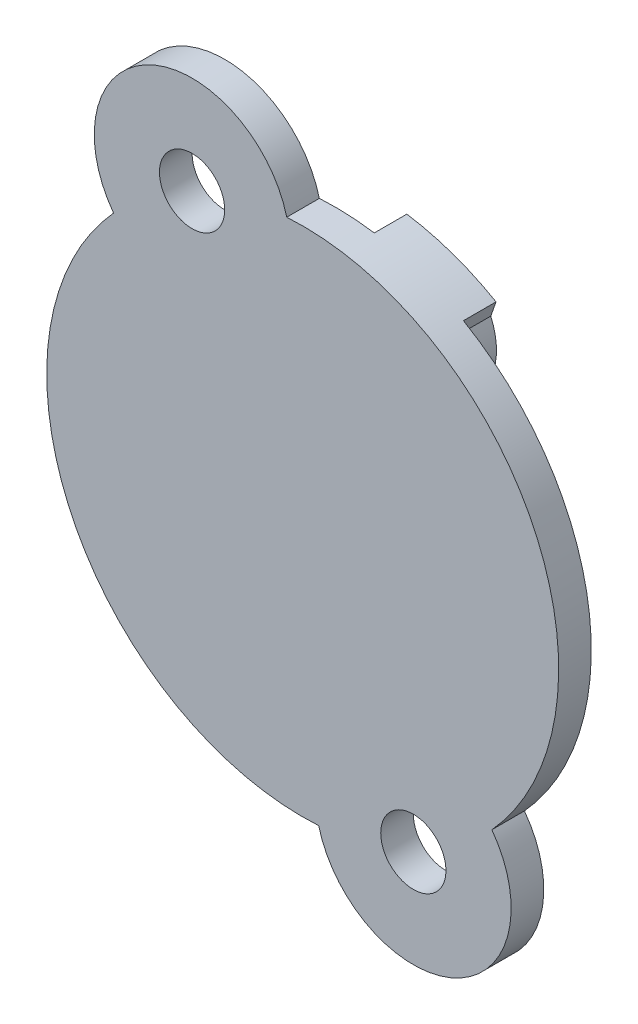
ISO-10303-21;
HEADER;
FILE_DESCRIPTION(('STEP AP214'),'2;1');
FILE_NAME('part.step','',(''),(''),'','','');
FILE_SCHEMA(('AUTOMOTIVE_DESIGN { 1 0 10303 214 1 1 1 1 }'));
ENDSEC;
DATA;
#1=APPLICATION_CONTEXT('core data for automotive mechanical design processes');
#2=APPLICATION_PROTOCOL_DEFINITION('international standard','automotive_design',2000,#1);
#3=PRODUCT_CONTEXT('',#1,'mechanical');
#4=PRODUCT('Part','Part','',(#3));
#5=PRODUCT_RELATED_PRODUCT_CATEGORY('part','',(#4));
#6=PRODUCT_DEFINITION_FORMATION('','',#4);
#7=PRODUCT_DEFINITION_CONTEXT('part definition',#1,'design');
#8=PRODUCT_DEFINITION('design','',#6,#7);
#9=PRODUCT_DEFINITION_SHAPE('','',#8);
#10=(LENGTH_UNIT() NAMED_UNIT(*) SI_UNIT(.MILLI.,.METRE.));
#11=(NAMED_UNIT(*) PLANE_ANGLE_UNIT() SI_UNIT($,.RADIAN.));
#12=(NAMED_UNIT(*) SI_UNIT($,.STERADIAN.) SOLID_ANGLE_UNIT());
#13=UNCERTAINTY_MEASURE_WITH_UNIT(LENGTH_MEASURE(1.E-05),#10,'distance_accuracy_value','');
#14=(GEOMETRIC_REPRESENTATION_CONTEXT(3) GLOBAL_UNCERTAINTY_ASSIGNED_CONTEXT((#13)) GLOBAL_UNIT_ASSIGNED_CONTEXT((#10,
#11,#12)) REPRESENTATION_CONTEXT('',''));
#15=CARTESIAN_POINT('',(0.,0.,0.));
#16=DIRECTION('',(0.,0.,1.));
#17=DIRECTION('',(1.,0.,0.));
#18=AXIS2_PLACEMENT_3D('',#15,#16,#17);
#19=CARTESIAN_POINT('',(0.,0.,1.));
#20=DIRECTION('',(0.,0.,-1.));
#21=DIRECTION('',(-1.,0.,0.));
#22=AXIS2_PLACEMENT_3D('',#19,#20,#21);
#23=CYLINDRICAL_SURFACE('',#22,7.85);
#24=CARTESIAN_POINT('',(0.,0.,0.));
#25=DIRECTION('',(0.,0.,1.));
#26=DIRECTION('',(1.,0.,0.));
#27=AXIS2_PLACEMENT_3D('',#24,#25,#26);
#28=CIRCLE('',#27,7.85);
#29=CARTESIAN_POINT('',(1.19385224811337,7.7586865389494,0.));
#30=VERTEX_POINT('',#29);
#31=CARTESIAN_POINT('',(-0.48961697061972,7.83471602689473,0.));
#32=VERTEX_POINT('',#31);
#33=EDGE_CURVE('E166',#30,#32,#28,.T.);
#34=ORIENTED_EDGE('',*,*,#33,.T.);
#35=DIRECTION('',(0.,0.,-1.));
#36=VECTOR('',#35,1.);
#37=CARTESIAN_POINT('',(-0.489616970619721,7.83471602689473,1.));
#38=LINE('',#37,#36);
#39=CARTESIAN_POINT('',(-0.48961697061972,7.83471602689473,1.));
#40=VERTEX_POINT('',#39);
#41=EDGE_CURVE('E67',#40,#32,#38,.T.);
#42=ORIENTED_EDGE('',*,*,#41,.F.);
#43=CARTESIAN_POINT('',(0.,0.,1.));
#44=DIRECTION('',(0.,0.,1.));
#45=DIRECTION('',(1.,0.,0.));
#46=AXIS2_PLACEMENT_3D('',#43,#44,#45);
#47=CIRCLE('',#46,7.85);
#48=CARTESIAN_POINT('',(5.80055716096692,-5.28923781109863,1.));
#49=VERTEX_POINT('',#48);
#50=EDGE_CURVE('E11',#49,#40,#47,.T.);
#51=ORIENTED_EDGE('',*,*,#50,.F.);
#52=DIRECTION('',(0.,0.,-1.));
#53=VECTOR('',#52,1.);
#54=CARTESIAN_POINT('',(5.80055716096691,-5.28923781109863,1.));
#55=LINE('',#54,#53);
#56=CARTESIAN_POINT('',(5.80055716096691,-5.28923781109863,0.));
#57=VERTEX_POINT('',#56);
#58=EDGE_CURVE('E192',#49,#57,#55,.T.);
#59=ORIENTED_EDGE('',*,*,#58,.T.);
#60=CARTESIAN_POINT('',(3.92933098166978,6.79579708617687,0.));
#61=VERTEX_POINT('',#60);
#62=EDGE_CURVE('E167',#57,#61,#28,.T.);
#63=ORIENTED_EDGE('',*,*,#62,.T.);
#64=DIRECTION('',(0.,0.,1.));
#65=VECTOR('',#64,1.);
#66=CARTESIAN_POINT('',(3.92933098166978,6.79579708617687,-1.));
#67=LINE('',#66,#65);
#68=CARTESIAN_POINT('',(3.92933098166978,6.79579708617687,-1.));
#69=VERTEX_POINT('',#68);
#70=EDGE_CURVE('E281',#69,#61,#67,.T.);
#71=ORIENTED_EDGE('',*,*,#70,.F.);
#72=CARTESIAN_POINT('',(0.,0.,-1.));
#73=DIRECTION('',(0.,0.,-1.));
#74=DIRECTION('',(-1.,0.,0.));
#75=AXIS2_PLACEMENT_3D('',#72,#73,#74);
#76=CIRCLE('',#75,7.85);
#77=CARTESIAN_POINT('',(1.19385224811337,7.7586865389494,-1.));
#78=VERTEX_POINT('',#77);
#79=EDGE_CURVE('E214',#78,#69,#76,.T.);
#80=ORIENTED_EDGE('',*,*,#79,.F.);
#81=DIRECTION('',(0.,0.,1.));
#82=VECTOR('',#81,1.);
#83=CARTESIAN_POINT('',(1.19385224811337,7.7586865389494,-1.));
#84=LINE('',#83,#82);
#85=EDGE_CURVE('E284',#78,#30,#84,.T.);
#86=ORIENTED_EDGE('',*,*,#85,.T.);
#87=EDGE_LOOP('',(#34,#42,#51,#59,#63,#71,#80,#86));
#88=FACE_BOUND('',#87,.T.);
#89=ADVANCED_FACE('F44',(#88),#23,.T.);
#90=CARTESIAN_POINT('',(0.,0.,0.));
#91=DIRECTION('',(0.,0.,1.));
#92=DIRECTION('',(1.,0.,0.));
#93=AXIS2_PLACEMENT_3D('',#90,#91,#92);
#94=PLANE('',#93);
#95=CARTESIAN_POINT('',(3.39285093810405,-7.07891676118645,0.));
#96=DIRECTION('',(0.,0.,-1.));
#97=DIRECTION('',(-1.,0.,0.));
#98=AXIS2_PLACEMENT_3D('',#95,#96,#97);
#99=CIRCLE('',#98,1.);
#100=CARTESIAN_POINT('',(2.39285093810405,-7.07891676118645,0.));
#101=VERTEX_POINT('',#100);
#102=EDGE_CURVE('E189',#101,#101,#99,.T.);
#103=ORIENTED_EDGE('',*,*,#102,.F.);
#104=EDGE_LOOP('',(#103));
#105=FACE_BOUND('',#104,.T.);
#106=CARTESIAN_POINT('',(-1.1938522481134,-7.7586865389494,0.));
#107=VERTEX_POINT('',#106);
#108=CARTESIAN_POINT('',(0.48961697061972,-7.83471602689473,0.));
#109=VERTEX_POINT('',#108);
#110=EDGE_CURVE('E48',#107,#109,#28,.T.);
#111=ORIENTED_EDGE('',*,*,#110,.F.);
#112=DIRECTION('',(0.332030845783635,0.943268528812556,0.));
#113=VECTOR('',#112,1.);
#114=CARTESIAN_POINT('',(1.3677393667782,-0.481444726386268,0.));
#115=LINE('',#114,#113);
#116=CARTESIAN_POINT('',(-1.03201281787639,-7.29891587847587,0.));
#117=VERTEX_POINT('',#116);
#118=EDGE_CURVE('E254',#107,#117,#115,.T.);
#119=ORIENTED_EDGE('',*,*,#118,.T.);
#120=CARTESIAN_POINT('',(-1.94238044783427,-5.51812089355345,0.));
#121=DIRECTION('',(0.,0.,-1.));
#122=DIRECTION('',(-1.,0.,0.));
#123=AXIS2_PLACEMENT_3D('',#120,#121,#122);
#124=CIRCLE('',#123,2.);
#125=CARTESIAN_POINT('',(-0.00130016548269144,-5.99999985913081,0.));
#126=VERTEX_POINT('',#125);
#127=EDGE_CURVE('E251',#126,#117,#124,.T.);
#128=ORIENTED_EDGE('',*,*,#127,.F.);
#129=CARTESIAN_POINT('',(0.,0.,0.));
#130=DIRECTION('',(0.,0.,-1.));
#131=DIRECTION('',(-1.,0.,0.));
#132=AXIS2_PLACEMENT_3D('',#129,#130,#131);
#133=CIRCLE('',#132,6.);
#134=CARTESIAN_POINT('',(3.75731738749284,4.6778805082691,0.));
#135=VERTEX_POINT('',#134);
#136=EDGE_CURVE('E239',#135,#126,#133,.T.);
#137=ORIENTED_EDGE('',*,*,#136,.F.);
#138=CARTESIAN_POINT('',(1.94238044783427,5.51812089355344,0.));
#139=DIRECTION('',(0.,0.,-1.));
#140=DIRECTION('',(-1.,0.,0.));
#141=AXIS2_PLACEMENT_3D('',#138,#139,#140);
#142=CIRCLE('',#141,2.);
#143=CARTESIAN_POINT('',(3.76749155143278,6.33602642570336,0.));
#144=VERTEX_POINT('',#143);
#145=EDGE_CURVE('E248',#144,#135,#142,.T.);
#146=ORIENTED_EDGE('',*,*,#145,.F.);
#147=DIRECTION('',(0.332030845783633,0.943268528812557,0.));
#148=VECTOR('',#147,1.);
#149=CARTESIAN_POINT('',(1.36773936677821,-0.481444726386269,0.));
#150=LINE('',#149,#148);
#151=EDGE_CURVE('E245',#144,#61,#150,.T.);
#152=ORIENTED_EDGE('',*,*,#151,.T.);
#153=ORIENTED_EDGE('',*,*,#62,.F.);
#154=CARTESIAN_POINT('',(3.39285093810405,-7.07891676118645,0.));
#155=DIRECTION('',(0.,0.,-1.));
#156=DIRECTION('',(-1.,0.,0.));
#157=AXIS2_PLACEMENT_3D('',#154,#155,#156);
#158=CIRCLE('',#157,3.);
#159=EDGE_CURVE('E183',#57,#109,#158,.T.);
#160=ORIENTED_EDGE('',*,*,#159,.T.);
#161=EDGE_LOOP('',(#111,#119,#128,#137,#146,#152,#153,#160));
#162=FACE_BOUND('',#161,.T.);
#163=ADVANCED_FACE('F305',(#105,#162),#94,.F.);
#164=CARTESIAN_POINT('',(-5.80055716096691,5.28923781109863,1.));
#165=VERTEX_POINT('',#164);
#166=CARTESIAN_POINT('',(0.48961697061972,-7.83471602689473,1.));
#167=VERTEX_POINT('',#166);
#168=EDGE_CURVE('E53',#165,#167,#47,.T.);
#169=ORIENTED_EDGE('',*,*,#168,.F.);
#170=DIRECTION('',(0.,0.,-1.));
#171=VECTOR('',#170,1.);
#172=CARTESIAN_POINT('',(-5.80055716096693,5.28923781109865,1.));
#173=LINE('',#172,#171);
#174=CARTESIAN_POINT('',(-5.80055716096693,5.28923781109865,0.));
#175=VERTEX_POINT('',#174);
#176=EDGE_CURVE('E168',#165,#175,#173,.T.);
#177=ORIENTED_EDGE('',*,*,#176,.T.);
#178=CARTESIAN_POINT('',(-3.92933098166981,-6.79579708617685,0.));
#179=VERTEX_POINT('',#178);
#180=EDGE_CURVE('E158',#175,#179,#28,.T.);
#181=ORIENTED_EDGE('',*,*,#180,.T.);
#182=DIRECTION('',(0.,0.,1.));
#183=VECTOR('',#182,1.);
#184=CARTESIAN_POINT('',(-3.92933098166981,-6.79579708617685,-1.));
#185=LINE('',#184,#183);
#186=CARTESIAN_POINT('',(-3.92933098166981,-6.79579708617685,-1.));
#187=VERTEX_POINT('',#186);
#188=EDGE_CURVE('E264',#187,#179,#185,.T.);
#189=ORIENTED_EDGE('',*,*,#188,.F.);
#190=CARTESIAN_POINT('',(0.,0.,-1.));
#191=DIRECTION('',(0.,0.,-1.));
#192=DIRECTION('',(-1.,0.,0.));
#193=AXIS2_PLACEMENT_3D('',#190,#191,#192);
#194=CIRCLE('',#193,7.85);
#195=CARTESIAN_POINT('',(-1.1938522481134,-7.7586865389494,-1.));
#196=VERTEX_POINT('',#195);
#197=EDGE_CURVE('E226',#196,#187,#194,.T.);
#198=ORIENTED_EDGE('',*,*,#197,.F.);
#199=DIRECTION('',(0.,0.,1.));
#200=VECTOR('',#199,1.);
#201=CARTESIAN_POINT('',(-1.1938522481134,-7.7586865389494,-1.));
#202=LINE('',#201,#200);
#203=EDGE_CURVE('E266',#196,#107,#202,.T.);
#204=ORIENTED_EDGE('',*,*,#203,.T.);
#205=ORIENTED_EDGE('',*,*,#110,.T.);
#206=DIRECTION('',(0.,0.,-1.));
#207=VECTOR('',#206,1.);
#208=CARTESIAN_POINT('',(0.48961697061972,-7.83471602689473,1.));
#209=LINE('',#208,#207);
#210=EDGE_CURVE('E197',#167,#109,#209,.T.);
#211=ORIENTED_EDGE('',*,*,#210,.F.);
#212=EDGE_LOOP('',(#169,#177,#181,#189,#198,#204,#205,#211));
#213=FACE_BOUND('',#212,.T.);
#214=ADVANCED_FACE('F46',(#213),#23,.T.);
#215=CARTESIAN_POINT('',(0.,0.,1.));
#216=DIRECTION('',(0.,0.,1.));
#217=DIRECTION('',(1.,0.,0.));
#218=AXIS2_PLACEMENT_3D('',#215,#216,#217);
#219=PLANE('',#218);
#220=CARTESIAN_POINT('',(3.39285093810405,-7.07891676118645,1.));
#221=DIRECTION('',(0.,0.,-1.));
#222=DIRECTION('',(-1.,0.,0.));
#223=AXIS2_PLACEMENT_3D('',#220,#221,#222);
#224=CIRCLE('',#223,1.);
#225=CARTESIAN_POINT('',(2.39285093810405,-7.07891676118645,1.));
#226=VERTEX_POINT('',#225);
#227=EDGE_CURVE('E188',#226,#226,#224,.T.);
#228=ORIENTED_EDGE('',*,*,#227,.T.);
#229=EDGE_LOOP('',(#228));
#230=FACE_BOUND('',#229,.T.);
#231=CARTESIAN_POINT('',(-3.39285093810405,7.07891676118645,1.));
#232=DIRECTION('',(0.,0.,-1.));
#233=DIRECTION('',(-1.,0.,0.));
#234=AXIS2_PLACEMENT_3D('',#231,#232,#233);
#235=CIRCLE('',#234,0.999999999999999);
#236=CARTESIAN_POINT('',(-4.39285093810405,7.07891676118645,1.));
#237=VERTEX_POINT('',#236);
#238=EDGE_CURVE('E172',#237,#237,#235,.T.);
#239=ORIENTED_EDGE('',*,*,#238,.T.);
#240=EDGE_LOOP('',(#239));
#241=FACE_BOUND('',#240,.T.);
#242=ORIENTED_EDGE('',*,*,#50,.T.);
#243=CARTESIAN_POINT('',(-3.39285093810405,7.07891676118645,1.));
#244=DIRECTION('',(0.,0.,-1.));
#245=DIRECTION('',(-1.,0.,0.));
#246=AXIS2_PLACEMENT_3D('',#243,#244,#245);
#247=CIRCLE('',#246,3.);
#248=EDGE_CURVE('E178',#165,#40,#247,.T.);
#249=ORIENTED_EDGE('',*,*,#248,.F.);
#250=ORIENTED_EDGE('',*,*,#168,.T.);
#251=CARTESIAN_POINT('',(3.39285093810405,-7.07891676118645,1.));
#252=DIRECTION('',(0.,0.,-1.));
#253=DIRECTION('',(-1.,0.,0.));
#254=AXIS2_PLACEMENT_3D('',#251,#252,#253);
#255=CIRCLE('',#254,3.);
#256=EDGE_CURVE('E185',#49,#167,#255,.T.);
#257=ORIENTED_EDGE('',*,*,#256,.F.);
#258=EDGE_LOOP('',(#242,#249,#250,#257));
#259=FACE_BOUND('',#258,.T.);
#260=ADVANCED_FACE('F298',(#230,#241,#259),#219,.T.);
#261=CARTESIAN_POINT('',(-3.39285093810405,7.07891676118645,0.));
#262=DIRECTION('',(0.,0.,-1.));
#263=DIRECTION('',(-1.,0.,0.));
#264=AXIS2_PLACEMENT_3D('',#261,#262,#263);
#265=CIRCLE('',#264,0.999999999999999);
#266=CARTESIAN_POINT('',(-4.39285093810405,7.07891676118645,0.));
#267=VERTEX_POINT('',#266);
#268=EDGE_CURVE('E175',#267,#267,#265,.T.);
#269=ORIENTED_EDGE('',*,*,#268,.F.);
#270=EDGE_LOOP('',(#269));
#271=FACE_BOUND('',#270,.T.);
#272=DIRECTION('',(0.332030845783634,0.943268528812557,0.));
#273=VECTOR('',#272,1.);
#274=CARTESIAN_POINT('',(-1.36773936677823,0.481444726386276,0.));
#275=LINE('',#274,#273);
#276=CARTESIAN_POINT('',(-3.7674915514328,-6.33602642570332,0.));
#277=VERTEX_POINT('',#276);
#278=EDGE_CURVE('E163',#179,#277,#275,.T.);
#279=ORIENTED_EDGE('',*,*,#278,.F.);
#280=ORIENTED_EDGE('',*,*,#180,.F.);
#281=CARTESIAN_POINT('',(-3.39285093810405,7.07891676118645,0.));
#282=DIRECTION('',(0.,0.,-1.));
#283=DIRECTION('',(-1.,0.,0.));
#284=AXIS2_PLACEMENT_3D('',#281,#282,#283);
#285=CIRCLE('',#284,3.);
#286=EDGE_CURVE('E161',#175,#32,#285,.T.);
#287=ORIENTED_EDGE('',*,*,#286,.T.);
#288=ORIENTED_EDGE('',*,*,#33,.F.);
#289=DIRECTION('',(0.332030845783635,0.943268528812556,0.));
#290=VECTOR('',#289,1.);
#291=CARTESIAN_POINT('',(-1.36773936677822,0.481444726386275,0.));
#292=LINE('',#291,#290);
#293=CARTESIAN_POINT('',(1.03201281787635,7.29891587847585,0.));
#294=VERTEX_POINT('',#293);
#295=EDGE_CURVE('E242',#294,#30,#292,.T.);
#296=ORIENTED_EDGE('',*,*,#295,.F.);
#297=CARTESIAN_POINT('',(1.94238044783427,5.51812089355344,0.));
#298=DIRECTION('',(0.,0.,-1.));
#299=DIRECTION('',(-1.,0.,0.));
#300=AXIS2_PLACEMENT_3D('',#297,#298,#299);
#301=CIRCLE('',#300,2.);
#302=CARTESIAN_POINT('',(0.00130016548269252,5.99999985913081,0.));
#303=VERTEX_POINT('',#302);
#304=EDGE_CURVE('E238',#303,#294,#301,.T.);
#305=ORIENTED_EDGE('',*,*,#304,.F.);
#306=CARTESIAN_POINT('',(-3.75731738749284,-4.6778805082691,0.));
#307=VERTEX_POINT('',#306);
#308=EDGE_CURVE('E235',#307,#303,#133,.T.);
#309=ORIENTED_EDGE('',*,*,#308,.F.);
#310=CARTESIAN_POINT('',(-1.94238044783427,-5.51812089355345,0.));
#311=DIRECTION('',(0.,0.,-1.));
#312=DIRECTION('',(-1.,0.,0.));
#313=AXIS2_PLACEMENT_3D('',#310,#311,#312);
#314=CIRCLE('',#313,2.);
#315=EDGE_CURVE('E206',#277,#307,#314,.T.);
#316=ORIENTED_EDGE('',*,*,#315,.F.);
#317=EDGE_LOOP('',(#279,#280,#287,#288,#296,#305,#309,#316));
#318=FACE_BOUND('',#317,.T.);
#319=ADVANCED_FACE('F159',(#271,#318),#94,.F.);
#320=CARTESIAN_POINT('',(0.,0.,-1.));
#321=DIRECTION('',(0.,0.,1.));
#322=DIRECTION('',(1.,0.,0.));
#323=AXIS2_PLACEMENT_3D('',#320,#321,#322);
#324=CYLINDRICAL_SURFACE('',#323,6.);
#325=ORIENTED_EDGE('',*,*,#308,.T.);
#326=DIRECTION('',(0.,0.,1.));
#327=VECTOR('',#326,1.);
#328=CARTESIAN_POINT('',(0.00130016548269252,5.99999985913081,-1.));
#329=LINE('',#328,#327);
#330=CARTESIAN_POINT('',(0.00130016548269252,5.99999985913081,-1.));
#331=VERTEX_POINT('',#330);
#332=EDGE_CURVE('E290',#331,#303,#329,.T.);
#333=ORIENTED_EDGE('',*,*,#332,.F.);
#334=CARTESIAN_POINT('',(0.,0.,-1.));
#335=DIRECTION('',(0.,0.,-1.));
#336=DIRECTION('',(-1.,0.,0.));
#337=AXIS2_PLACEMENT_3D('',#334,#335,#336);
#338=CIRCLE('',#337,6.);
#339=CARTESIAN_POINT('',(-3.75731738749284,-4.6778805082691,-1.));
#340=VERTEX_POINT('',#339);
#341=EDGE_CURVE('E205',#340,#331,#338,.T.);
#342=ORIENTED_EDGE('',*,*,#341,.F.);
#343=DIRECTION('',(0.,0.,1.));
#344=VECTOR('',#343,1.);
#345=CARTESIAN_POINT('',(-3.75731738749284,-4.6778805082691,-1.));
#346=LINE('',#345,#344);
#347=EDGE_CURVE('E232',#340,#307,#346,.T.);
#348=ORIENTED_EDGE('',*,*,#347,.T.);
#349=EDGE_LOOP('',(#325,#333,#342,#348));
#350=FACE_BOUND('',#349,.T.);
#351=ADVANCED_FACE('F336',(#350),#324,.T.);
#352=CARTESIAN_POINT('',(1.94238044783427,5.51812089355344,-1.));
#353=DIRECTION('',(0.,0.,1.));
#354=DIRECTION('',(1.,0.,0.));
#355=AXIS2_PLACEMENT_3D('',#352,#353,#354);
#356=CYLINDRICAL_SURFACE('',#355,2.);
#357=ORIENTED_EDGE('',*,*,#304,.T.);
#358=DIRECTION('',(0.,0.,1.));
#359=VECTOR('',#358,1.);
#360=CARTESIAN_POINT('',(1.03201281787635,7.29891587847585,-1.));
#361=LINE('',#360,#359);
#362=CARTESIAN_POINT('',(1.03201281787635,7.29891587847585,-1.));
#363=VERTEX_POINT('',#362);
#364=EDGE_CURVE('E287',#363,#294,#361,.T.);
#365=ORIENTED_EDGE('',*,*,#364,.F.);
#366=CARTESIAN_POINT('',(1.94238044783427,5.51812089355344,-1.));
#367=DIRECTION('',(0.,0.,-1.));
#368=DIRECTION('',(-1.,0.,0.));
#369=AXIS2_PLACEMENT_3D('',#366,#367,#368);
#370=CIRCLE('',#369,2.);
#371=EDGE_CURVE('E209',#331,#363,#370,.T.);
#372=ORIENTED_EDGE('',*,*,#371,.F.);
#373=ORIENTED_EDGE('',*,*,#332,.T.);
#374=EDGE_LOOP('',(#357,#365,#372,#373));
#375=FACE_BOUND('',#374,.T.);
#376=ADVANCED_FACE('F345',(#375),#356,.T.);
#377=CARTESIAN_POINT('',(-1.36773936677822,0.481444726386275,-1.));
#378=DIRECTION('',(0.943268528812556,-0.332030845783635,0.));
#379=DIRECTION('',(0.332030845783635,0.943268528812556,0.));
#380=AXIS2_PLACEMENT_3D('',#377,#378,#379);
#381=PLANE('',#380);
#382=ORIENTED_EDGE('',*,*,#295,.T.);
#383=ORIENTED_EDGE('',*,*,#85,.F.);
#384=DIRECTION('',(0.332030845783635,0.943268528812556,0.));
#385=VECTOR('',#384,1.);
#386=CARTESIAN_POINT('',(-1.36773936677822,0.481444726386275,-1.));
#387=LINE('',#386,#385);
#388=EDGE_CURVE('E212',#363,#78,#387,.T.);
#389=ORIENTED_EDGE('',*,*,#388,.F.);
#390=ORIENTED_EDGE('',*,*,#364,.T.);
#391=EDGE_LOOP('',(#382,#383,#389,#390));
#392=FACE_BOUND('',#391,.T.);
#393=ADVANCED_FACE('F348',(#392),#381,.F.);
#394=CARTESIAN_POINT('',(1.36773936677821,-0.481444726386269,-1.));
#395=DIRECTION('',(0.943268528812557,-0.332030845783633,0.));
#396=DIRECTION('',(0.332030845783633,0.943268528812557,0.));
#397=AXIS2_PLACEMENT_3D('',#394,#395,#396);
#398=PLANE('',#397);
#399=ORIENTED_EDGE('',*,*,#151,.F.);
#400=DIRECTION('',(0.,0.,1.));
#401=VECTOR('',#400,1.);
#402=CARTESIAN_POINT('',(3.76749155143278,6.33602642570336,-1.));
#403=LINE('',#402,#401);
#404=CARTESIAN_POINT('',(3.76749155143278,6.33602642570336,-1.));
#405=VERTEX_POINT('',#404);
#406=EDGE_CURVE('E278',#405,#144,#403,.T.);
#407=ORIENTED_EDGE('',*,*,#406,.F.);
#408=DIRECTION('',(0.332030845783633,0.943268528812557,0.));
#409=VECTOR('',#408,1.);
#410=CARTESIAN_POINT('',(1.36773936677821,-0.481444726386269,-1.));
#411=LINE('',#410,#409);
#412=EDGE_CURVE('E216',#405,#69,#411,.T.);
#413=ORIENTED_EDGE('',*,*,#412,.T.);
#414=ORIENTED_EDGE('',*,*,#70,.T.);
#415=EDGE_LOOP('',(#399,#407,#413,#414));
#416=FACE_BOUND('',#415,.T.);
#417=ADVANCED_FACE('F351',(#416),#398,.T.);
#418=CARTESIAN_POINT('',(1.94238044783427,5.51812089355344,-1.));
#419=DIRECTION('',(0.,0.,1.));
#420=DIRECTION('',(1.,0.,0.));
#421=AXIS2_PLACEMENT_3D('',#418,#419,#420);
#422=CYLINDRICAL_SURFACE('',#421,2.);
#423=ORIENTED_EDGE('',*,*,#145,.T.);
#424=DIRECTION('',(0.,0.,1.));
#425=VECTOR('',#424,1.);
#426=CARTESIAN_POINT('',(3.75731738749284,4.6778805082691,-1.));
#427=LINE('',#426,#425);
#428=CARTESIAN_POINT('',(3.75731738749284,4.6778805082691,-1.));
#429=VERTEX_POINT('',#428);
#430=EDGE_CURVE('E275',#429,#135,#427,.T.);
#431=ORIENTED_EDGE('',*,*,#430,.F.);
#432=CARTESIAN_POINT('',(1.94238044783427,5.51812089355344,-1.));
#433=DIRECTION('',(0.,0.,-1.));
#434=DIRECTION('',(-1.,0.,0.));
#435=AXIS2_PLACEMENT_3D('',#432,#433,#434);
#436=CIRCLE('',#435,2.);
#437=EDGE_CURVE('E219',#405,#429,#436,.T.);
#438=ORIENTED_EDGE('',*,*,#437,.F.);
#439=ORIENTED_EDGE('',*,*,#406,.T.);
#440=EDGE_LOOP('',(#423,#431,#438,#439));
#441=FACE_BOUND('',#440,.T.);
#442=ADVANCED_FACE('F355',(#441),#422,.T.);
#443=ORIENTED_EDGE('',*,*,#136,.T.);
#444=DIRECTION('',(0.,0.,1.));
#445=VECTOR('',#444,1.);
#446=CARTESIAN_POINT('',(-0.00130016548269144,-5.99999985913081,-1.));
#447=LINE('',#446,#445);
#448=CARTESIAN_POINT('',(-0.00130016548269144,-5.99999985913081,-1.));
#449=VERTEX_POINT('',#448);
#450=EDGE_CURVE('E272',#449,#126,#447,.T.);
#451=ORIENTED_EDGE('',*,*,#450,.F.);
#452=EDGE_CURVE('E210',#429,#449,#338,.T.);
#453=ORIENTED_EDGE('',*,*,#452,.F.);
#454=ORIENTED_EDGE('',*,*,#430,.T.);
#455=EDGE_LOOP('',(#443,#451,#453,#454));
#456=FACE_BOUND('',#455,.T.);
#457=ADVANCED_FACE('F359',(#456),#324,.T.);
#458=CARTESIAN_POINT('',(-1.94238044783427,-5.51812089355345,-1.));
#459=DIRECTION('',(0.,0.,1.));
#460=DIRECTION('',(1.,0.,0.));
#461=AXIS2_PLACEMENT_3D('',#458,#459,#460);
#462=CYLINDRICAL_SURFACE('',#461,2.);
#463=ORIENTED_EDGE('',*,*,#127,.T.);
#464=DIRECTION('',(0.,0.,1.));
#465=VECTOR('',#464,1.);
#466=CARTESIAN_POINT('',(-1.03201281787639,-7.29891587847587,-1.));
#467=LINE('',#466,#465);
#468=CARTESIAN_POINT('',(-1.03201281787639,-7.29891587847587,-1.));
#469=VERTEX_POINT('',#468);
#470=EDGE_CURVE('E269',#469,#117,#467,.T.);
#471=ORIENTED_EDGE('',*,*,#470,.F.);
#472=CARTESIAN_POINT('',(-1.94238044783427,-5.51812089355345,-1.));
#473=DIRECTION('',(0.,0.,-1.));
#474=DIRECTION('',(-1.,0.,0.));
#475=AXIS2_PLACEMENT_3D('',#472,#473,#474);
#476=CIRCLE('',#475,2.);
#477=EDGE_CURVE('E221',#449,#469,#476,.T.);
#478=ORIENTED_EDGE('',*,*,#477,.F.);
#479=ORIENTED_EDGE('',*,*,#450,.T.);
#480=EDGE_LOOP('',(#463,#471,#478,#479));
#481=FACE_BOUND('',#480,.T.);
#482=ADVANCED_FACE('F363',(#481),#462,.T.);
#483=CARTESIAN_POINT('',(1.3677393667782,-0.481444726386268,-1.));
#484=DIRECTION('',(0.943268528812556,-0.332030845783635,0.));
#485=DIRECTION('',(0.332030845783635,0.943268528812556,0.));
#486=AXIS2_PLACEMENT_3D('',#483,#484,#485);
#487=PLANE('',#486);
#488=ORIENTED_EDGE('',*,*,#118,.F.);
#489=ORIENTED_EDGE('',*,*,#203,.F.);
#490=DIRECTION('',(0.332030845783635,0.943268528812556,0.));
#491=VECTOR('',#490,1.);
#492=CARTESIAN_POINT('',(1.3677393667782,-0.481444726386268,-1.));
#493=LINE('',#492,#491);
#494=EDGE_CURVE('E223',#196,#469,#493,.T.);
#495=ORIENTED_EDGE('',*,*,#494,.T.);
#496=ORIENTED_EDGE('',*,*,#470,.T.);
#497=EDGE_LOOP('',(#488,#489,#495,#496));
#498=FACE_BOUND('',#497,.T.);
#499=ADVANCED_FACE('F367',(#498),#487,.T.);
#500=CARTESIAN_POINT('',(-1.36773936677823,0.481444726386276,-1.));
#501=DIRECTION('',(0.943268528812557,-0.332030845783634,0.));
#502=DIRECTION('',(0.332030845783634,0.943268528812557,0.));
#503=AXIS2_PLACEMENT_3D('',#500,#501,#502);
#504=PLANE('',#503);
#505=ORIENTED_EDGE('',*,*,#278,.T.);
#506=DIRECTION('',(0.,0.,1.));
#507=VECTOR('',#506,1.);
#508=CARTESIAN_POINT('',(-3.7674915514328,-6.33602642570332,-1.));
#509=LINE('',#508,#507);
#510=CARTESIAN_POINT('',(-3.7674915514328,-6.33602642570332,-1.));
#511=VERTEX_POINT('',#510);
#512=EDGE_CURVE('E261',#511,#277,#509,.T.);
#513=ORIENTED_EDGE('',*,*,#512,.F.);
#514=DIRECTION('',(0.332030845783634,0.943268528812557,0.));
#515=VECTOR('',#514,1.);
#516=CARTESIAN_POINT('',(-1.36773936677823,0.481444726386276,-1.));
#517=LINE('',#516,#515);
#518=EDGE_CURVE('E228',#187,#511,#517,.T.);
#519=ORIENTED_EDGE('',*,*,#518,.F.);
#520=ORIENTED_EDGE('',*,*,#188,.T.);
#521=EDGE_LOOP('',(#505,#513,#519,#520));
#522=FACE_BOUND('',#521,.T.);
#523=ADVANCED_FACE('F343',(#522),#504,.F.);
#524=CARTESIAN_POINT('',(0.,0.,-1.));
#525=DIRECTION('',(0.,0.,1.));
#526=DIRECTION('',(1.,0.,0.));
#527=AXIS2_PLACEMENT_3D('',#524,#525,#526);
#528=CYLINDRICAL_SURFACE('',#527,4.5);
#529=CARTESIAN_POINT('',(0.,0.,-1.));
#530=DIRECTION('',(0.,0.,-1.));
#531=DIRECTION('',(-1.,0.,0.));
#532=AXIS2_PLACEMENT_3D('',#529,#530,#531);
#533=CIRCLE('',#532,4.5);
#534=CARTESIAN_POINT('',(-4.5,0.,-1.));
#535=VERTEX_POINT('',#534);
#536=EDGE_CURVE('E202',#535,#535,#533,.T.);
#537=ORIENTED_EDGE('',*,*,#536,.T.);
#538=EDGE_LOOP('',(#537));
#539=FACE_BOUND('',#538,.T.);
#540=CARTESIAN_POINT('',(0.,0.,0.));
#541=DIRECTION('',(0.,0.,-1.));
#542=DIRECTION('',(-1.,0.,0.));
#543=AXIS2_PLACEMENT_3D('',#540,#541,#542);
#544=CIRCLE('',#543,4.5);
#545=CARTESIAN_POINT('',(-4.5,0.,0.));
#546=VERTEX_POINT('',#545);
#547=EDGE_CURVE('E199',#546,#546,#544,.T.);
#548=ORIENTED_EDGE('',*,*,#547,.F.);
#549=EDGE_LOOP('',(#548));
#550=FACE_BOUND('',#549,.T.);
#551=ADVANCED_FACE('F339',(#539,#550),#528,.F.);
#552=CARTESIAN_POINT('',(-1.94238044783427,-5.51812089355345,-1.));
#553=DIRECTION('',(0.,0.,1.));
#554=DIRECTION('',(1.,0.,0.));
#555=AXIS2_PLACEMENT_3D('',#552,#553,#554);
#556=CYLINDRICAL_SURFACE('',#555,2.);
#557=ORIENTED_EDGE('',*,*,#315,.T.);
#558=ORIENTED_EDGE('',*,*,#347,.F.);
#559=CARTESIAN_POINT('',(-1.94238044783427,-5.51812089355345,-1.));
#560=DIRECTION('',(0.,0.,-1.));
#561=DIRECTION('',(-1.,0.,0.));
#562=AXIS2_PLACEMENT_3D('',#559,#560,#561);
#563=CIRCLE('',#562,2.);
#564=EDGE_CURVE('E230',#511,#340,#563,.T.);
#565=ORIENTED_EDGE('',*,*,#564,.F.);
#566=ORIENTED_EDGE('',*,*,#512,.T.);
#567=EDGE_LOOP('',(#557,#558,#565,#566));
#568=FACE_BOUND('',#567,.T.);
#569=ADVANCED_FACE('F342',(#568),#556,.T.);
#570=CARTESIAN_POINT('',(0.,0.,-1.));
#571=DIRECTION('',(0.,0.,-1.));
#572=DIRECTION('',(-1.,0.,0.));
#573=AXIS2_PLACEMENT_3D('',#570,#571,#572);
#574=PLANE('',#573);
#575=ORIENTED_EDGE('',*,*,#536,.F.);
#576=EDGE_LOOP('',(#575));
#577=FACE_BOUND('',#576,.T.);
#578=ORIENTED_EDGE('',*,*,#341,.T.);
#579=ORIENTED_EDGE('',*,*,#371,.T.);
#580=ORIENTED_EDGE('',*,*,#388,.T.);
#581=ORIENTED_EDGE('',*,*,#79,.T.);
#582=ORIENTED_EDGE('',*,*,#412,.F.);
#583=ORIENTED_EDGE('',*,*,#437,.T.);
#584=ORIENTED_EDGE('',*,*,#452,.T.);
#585=ORIENTED_EDGE('',*,*,#477,.T.);
#586=ORIENTED_EDGE('',*,*,#494,.F.);
#587=ORIENTED_EDGE('',*,*,#197,.T.);
#588=ORIENTED_EDGE('',*,*,#518,.T.);
#589=ORIENTED_EDGE('',*,*,#564,.T.);
#590=EDGE_LOOP('',(#578,#579,#580,#581,#582,#583,#584,#585,#586,#587,#588,#589));
#591=FACE_BOUND('',#590,.T.);
#592=ADVANCED_FACE('F377',(#577,#591),#574,.T.);
#593=ORIENTED_EDGE('',*,*,#547,.T.);
#594=EDGE_LOOP('',(#593));
#595=FACE_BOUND('',#594,.T.);
#596=ADVANCED_FACE('F326',(#595),#94,.F.);
#597=CARTESIAN_POINT('',(3.39285093810405,-7.07891676118645,1.));
#598=DIRECTION('',(0.,0.,-1.));
#599=DIRECTION('',(-1.,0.,0.));
#600=AXIS2_PLACEMENT_3D('',#597,#598,#599);
#601=CYLINDRICAL_SURFACE('',#600,1.);
#602=ORIENTED_EDGE('',*,*,#102,.T.);
#603=EDGE_LOOP('',(#602));
#604=FACE_BOUND('',#603,.T.);
#605=ORIENTED_EDGE('',*,*,#227,.F.);
#606=EDGE_LOOP('',(#605));
#607=FACE_BOUND('',#606,.T.);
#608=ADVANCED_FACE('F319',(#604,#607),#601,.F.);
#609=CARTESIAN_POINT('',(3.39285093810405,-7.07891676118645,1.));
#610=DIRECTION('',(0.,0.,-1.));
#611=DIRECTION('',(-1.,0.,0.));
#612=AXIS2_PLACEMENT_3D('',#609,#610,#611);
#613=CYLINDRICAL_SURFACE('',#612,3.);
#614=ORIENTED_EDGE('',*,*,#159,.F.);
#615=ORIENTED_EDGE('',*,*,#58,.F.);
#616=ORIENTED_EDGE('',*,*,#256,.T.);
#617=ORIENTED_EDGE('',*,*,#210,.T.);
#618=EDGE_LOOP('',(#614,#615,#616,#617));
#619=FACE_BOUND('',#618,.T.);
#620=ADVANCED_FACE('F301',(#619),#613,.T.);
#621=CARTESIAN_POINT('',(-3.39285093810405,7.07891676118645,1.));
#622=DIRECTION('',(0.,0.,-1.));
#623=DIRECTION('',(-1.,0.,0.));
#624=AXIS2_PLACEMENT_3D('',#621,#622,#623);
#625=CYLINDRICAL_SURFACE('',#624,0.999999999999999);
#626=ORIENTED_EDGE('',*,*,#268,.T.);
#627=EDGE_LOOP('',(#626));
#628=FACE_BOUND('',#627,.T.);
#629=ORIENTED_EDGE('',*,*,#238,.F.);
#630=EDGE_LOOP('',(#629));
#631=FACE_BOUND('',#630,.T.);
#632=ADVANCED_FACE('F310',(#628,#631),#625,.F.);
#633=CARTESIAN_POINT('',(-3.39285093810405,7.07891676118645,1.));
#634=DIRECTION('',(0.,0.,-1.));
#635=DIRECTION('',(-1.,0.,0.));
#636=AXIS2_PLACEMENT_3D('',#633,#634,#635);
#637=CYLINDRICAL_SURFACE('',#636,3.);
#638=ORIENTED_EDGE('',*,*,#286,.F.);
#639=ORIENTED_EDGE('',*,*,#176,.F.);
#640=ORIENTED_EDGE('',*,*,#248,.T.);
#641=ORIENTED_EDGE('',*,*,#41,.T.);
#642=EDGE_LOOP('',(#638,#639,#640,#641));
#643=FACE_BOUND('',#642,.T.);
#644=ADVANCED_FACE('F174',(#643),#637,.T.);
#645=CLOSED_SHELL('',(#89,#163,#214,#260,#319,#351,#376,#393,#417,#442,#457,#482,#499,#523,#551,
#569,#592,#596,#608,#620,#632,#644));
#646=MANIFOLD_SOLID_BREP('B2',#645);
#647=ADVANCED_BREP_SHAPE_REPRESENTATION('',(#18,#646),#14);
#648=SHAPE_DEFINITION_REPRESENTATION(#9,#647);
ENDSEC;
END-ISO-10303-21;
